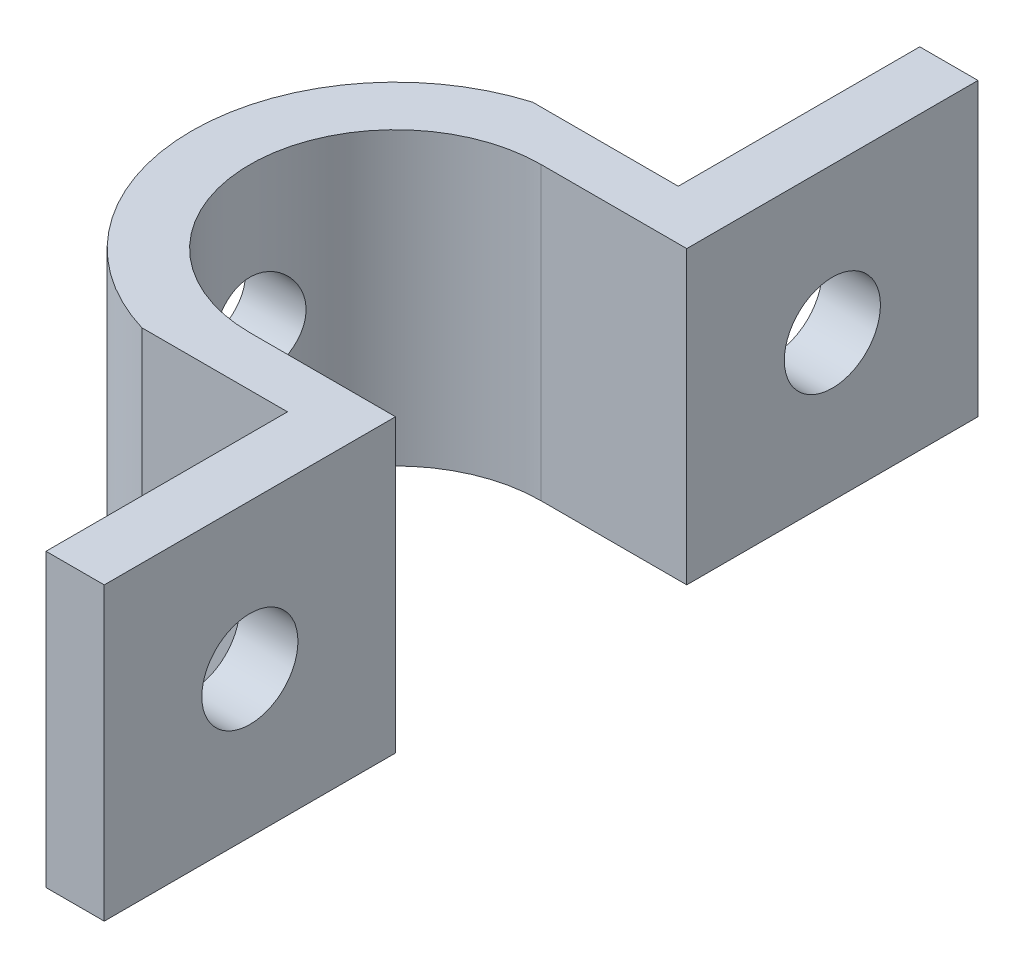
ISO-10303-21;
HEADER;
FILE_DESCRIPTION(('STEP AP214'),'2;1');
FILE_NAME('part.step','',(''),(''),'','','');
FILE_SCHEMA(('AUTOMOTIVE_DESIGN { 1 0 10303 214 1 1 1 1 }'));
ENDSEC;
DATA;
#1=APPLICATION_CONTEXT('core data for automotive mechanical design processes');
#2=APPLICATION_PROTOCOL_DEFINITION('international standard','automotive_design',2000,#1);
#3=PRODUCT_CONTEXT('',#1,'mechanical');
#4=PRODUCT('Part','Part','',(#3));
#5=PRODUCT_RELATED_PRODUCT_CATEGORY('part','',(#4));
#6=PRODUCT_DEFINITION_FORMATION('','',#4);
#7=PRODUCT_DEFINITION_CONTEXT('part definition',#1,'design');
#8=PRODUCT_DEFINITION('design','',#6,#7);
#9=PRODUCT_DEFINITION_SHAPE('','',#8);
#10=(LENGTH_UNIT() NAMED_UNIT(*) SI_UNIT(.MILLI.,.METRE.));
#11=(NAMED_UNIT(*) PLANE_ANGLE_UNIT() SI_UNIT($,.RADIAN.));
#12=(NAMED_UNIT(*) SI_UNIT($,.STERADIAN.) SOLID_ANGLE_UNIT());
#13=UNCERTAINTY_MEASURE_WITH_UNIT(LENGTH_MEASURE(1.E-05),#10,'distance_accuracy_value','');
#14=(GEOMETRIC_REPRESENTATION_CONTEXT(3) GLOBAL_UNCERTAINTY_ASSIGNED_CONTEXT((#13)) GLOBAL_UNIT_ASSIGNED_CONTEXT((#10,
#11,#12)) REPRESENTATION_CONTEXT('',''));
#15=CARTESIAN_POINT('',(0.,0.,0.));
#16=DIRECTION('',(0.,0.,1.));
#17=DIRECTION('',(1.,0.,0.));
#18=AXIS2_PLACEMENT_3D('',#15,#16,#17);
#19=CARTESIAN_POINT('',(-2.,10.,0.));
#20=DIRECTION('',(0.,0.,1.));
#21=DIRECTION('',(1.,0.,0.));
#22=AXIS2_PLACEMENT_3D('',#19,#20,#21);
#23=PLANE('',#22);
#24=DIRECTION('',(0.,-1.,0.));
#25=VECTOR('',#24,1.);
#26=CARTESIAN_POINT('',(3.,10.,0.));
#27=LINE('',#26,#25);
#28=CARTESIAN_POINT('',(3.,10.,0.));
#29=VERTEX_POINT('',#28);
#30=CARTESIAN_POINT('',(3.,0.,0.));
#31=VERTEX_POINT('',#30);
#32=EDGE_CURVE('E71',#29,#31,#27,.T.);
#33=ORIENTED_EDGE('',*,*,#32,.F.);
#34=DIRECTION('',(-1.,0.,0.));
#35=VECTOR('',#34,1.);
#36=CARTESIAN_POINT('',(-2.,10.,0.));
#37=LINE('',#36,#35);
#38=CARTESIAN_POINT('',(5.,10.,0.));
#39=VERTEX_POINT('',#38);
#40=EDGE_CURVE('E206',#39,#29,#37,.T.);
#41=ORIENTED_EDGE('',*,*,#40,.F.);
#42=DIRECTION('',(0.,1.,0.));
#43=VECTOR('',#42,1.);
#44=CARTESIAN_POINT('',(5.,0.,0.));
#45=LINE('',#44,#43);
#46=CARTESIAN_POINT('',(5.,0.,0.));
#47=VERTEX_POINT('',#46);
#48=EDGE_CURVE('E180',#47,#39,#45,.T.);
#49=ORIENTED_EDGE('',*,*,#48,.F.);
#50=DIRECTION('',(-1.,0.,0.));
#51=VECTOR('',#50,1.);
#52=CARTESIAN_POINT('',(-2.,0.,0.));
#53=LINE('',#52,#51);
#54=EDGE_CURVE('E191',#47,#31,#53,.T.);
#55=ORIENTED_EDGE('',*,*,#54,.T.);
#56=EDGE_LOOP('',(#33,#41,#49,#55));
#57=FACE_BOUND('',#56,.T.);
#58=ADVANCED_FACE('F43',(#57),#23,.F.);
#59=CARTESIAN_POINT('',(-2.,10.,30.));
#60=DIRECTION('',(0.,0.,-1.));
#61=DIRECTION('',(-1.,0.,0.));
#62=AXIS2_PLACEMENT_3D('',#59,#60,#61);
#63=PLANE('',#62);
#64=DIRECTION('',(0.,1.,0.));
#65=VECTOR('',#64,1.);
#66=CARTESIAN_POINT('',(3.,0.,30.));
#67=LINE('',#66,#65);
#68=CARTESIAN_POINT('',(3.,0.,30.));
#69=VERTEX_POINT('',#68);
#70=CARTESIAN_POINT('',(3.,10.,30.));
#71=VERTEX_POINT('',#70);
#72=EDGE_CURVE('E168',#69,#71,#67,.T.);
#73=ORIENTED_EDGE('',*,*,#72,.F.);
#74=DIRECTION('',(1.,0.,0.));
#75=VECTOR('',#74,1.);
#76=CARTESIAN_POINT('',(-2.,0.,30.));
#77=LINE('',#76,#75);
#78=CARTESIAN_POINT('',(5.,0.,30.));
#79=VERTEX_POINT('',#78);
#80=EDGE_CURVE('E220',#69,#79,#77,.T.);
#81=ORIENTED_EDGE('',*,*,#80,.T.);
#82=DIRECTION('',(0.,-1.,0.));
#83=VECTOR('',#82,1.);
#84=CARTESIAN_POINT('',(5.,10.,30.));
#85=LINE('',#84,#83);
#86=CARTESIAN_POINT('',(5.,10.,30.));
#87=VERTEX_POINT('',#86);
#88=EDGE_CURVE('E177',#87,#79,#85,.T.);
#89=ORIENTED_EDGE('',*,*,#88,.F.);
#90=DIRECTION('',(1.,0.,0.));
#91=VECTOR('',#90,1.);
#92=CARTESIAN_POINT('',(-2.,10.,30.));
#93=LINE('',#92,#91);
#94=EDGE_CURVE('E213',#71,#87,#93,.T.);
#95=ORIENTED_EDGE('',*,*,#94,.F.);
#96=EDGE_LOOP('',(#73,#81,#89,#95));
#97=FACE_BOUND('',#96,.T.);
#98=ADVANCED_FACE('F310',(#97),#63,.F.);
#99=CARTESIAN_POINT('',(0.,10.,15.));
#100=DIRECTION('',(0.,-1.,0.));
#101=DIRECTION('',(0.,0.,-1.));
#102=AXIS2_PLACEMENT_3D('',#99,#100,#101);
#103=CYLINDRICAL_SURFACE('',#102,7.);
#104=CARTESIAN_POINT('',(-6.80275679412398,5.,16.65));
#105=CARTESIAN_POINT('',(-6.80275861136205,4.90871099997652,16.6499971300732));
#106=CARTESIAN_POINT('',(-6.80461440498174,4.81738900161891,16.6423981344));
#107=CARTESIAN_POINT('',(-6.81182064992733,4.63735543656597,16.612244147676));
#108=CARTESIAN_POINT('',(-6.81717336620826,4.54864560071145,16.5896794632121));
#109=CARTESIAN_POINT('',(-6.83073431325551,4.37646648747663,16.5303551503609));
#110=CARTESIAN_POINT('',(-6.83893911932177,4.29299106604051,16.4936125405845));
#111=CARTESIAN_POINT('',(-6.85727558075245,4.13338346720995,16.4070258185496));
#112=CARTESIAN_POINT('',(-6.86740726130097,4.05725138581207,16.3571815350499));
#113=CARTESIAN_POINT('',(-6.88867782513987,3.91300017131405,16.2447646190835));
#114=CARTESIAN_POINT('',(-6.89983131541127,3.84504595472281,16.1819830935587));
#115=CARTESIAN_POINT('',(-6.92176152937785,3.72052828829883,16.0459242729893));
#116=CARTESIAN_POINT('',(-6.93253822068664,3.66396581562248,15.9726460784875));
#117=CARTESIAN_POINT('',(-6.95266103704034,3.56317303018273,15.816555491677));
#118=CARTESIAN_POINT('',(-6.96198791366554,3.51910313876716,15.7336368144797));
#119=CARTESIAN_POINT('',(-6.97799434603916,3.44558709172224,15.5613128385626));
#120=CARTESIAN_POINT('',(-6.98467424785277,3.41613902430984,15.4719083896014));
#121=CARTESIAN_POINT('',(-6.99453084372035,3.37322629782888,15.2908680220524));
#122=CARTESIAN_POINT('',(-6.99776875317269,3.35948200603305,15.1993017757155));
#123=CARTESIAN_POINT('',(-7.00058928212562,3.34749086323874,15.0151097839079));
#124=CARTESIAN_POINT('',(-7.00017238432294,3.34924196573697,14.9224841799622));
#125=CARTESIAN_POINT('',(-6.99577641572094,3.36798740501016,14.74073663216));
#126=CARTESIAN_POINT('',(-6.99186783471482,3.38468011500454,14.6515816196809));
#127=CARTESIAN_POINT('',(-6.98100889430398,3.43235207443573,14.4773753750162));
#128=CARTESIAN_POINT('',(-6.97405838372646,3.46333203390087,14.3923243470169));
#129=CARTESIAN_POINT('',(-6.95778608866946,3.53895377039328,14.2279256132054));
#130=CARTESIAN_POINT('',(-6.94844521053821,3.58370617046967,14.148630760275));
#131=CARTESIAN_POINT('',(-6.92841069918988,3.685519225885,13.998568639297));
#132=CARTESIAN_POINT('',(-6.91771685448099,3.74258180650105,13.92780270785));
#133=CARTESIAN_POINT('',(-6.89584251761335,3.86902452509401,13.7950103439417));
#134=CARTESIAN_POINT('',(-6.88465650871199,3.93866849569449,13.7332357899427));
#135=CARTESIAN_POINT('',(-6.86329717958811,4.0874443211498,13.6221906360801));
#136=CARTESIAN_POINT('',(-6.85312389657327,4.16657652436841,13.5729204955273));
#137=CARTESIAN_POINT('',(-6.83492437266263,4.33253525980705,13.4881452284223));
#138=CARTESIAN_POINT('',(-6.82690665922475,4.41939059395085,13.4526945301079));
#139=CARTESIAN_POINT('',(-6.8140390867396,4.59806127756916,13.3969722848722));
#140=CARTESIAN_POINT('',(-6.80918863409247,4.68987569413077,13.3766978935421));
#141=CARTESIAN_POINT('',(-6.80332774943589,4.87353855694924,13.3523087210196));
#142=CARTESIAN_POINT('',(-6.80222947433876,4.96533515973006,13.3478242013954));
#143=CARTESIAN_POINT('',(-6.80375919481422,5.14836457658374,13.3541351120498));
#144=CARTESIAN_POINT('',(-6.80638688917233,5.23959743563189,13.3649293071677));
#145=CARTESIAN_POINT('',(-6.81498886694796,5.41757745074747,13.4011685953919));
#146=CARTESIAN_POINT('',(-6.82091521063605,5.50436984565375,13.4264039574829));
#147=CARTESIAN_POINT('',(-6.83540229380027,5.67249368663451,13.4905793012613));
#148=CARTESIAN_POINT('',(-6.84396331787599,5.75382454159378,13.5295207635542));
#149=CARTESIAN_POINT('',(-6.86294389007106,5.91029905658938,13.6207958904044));
#150=CARTESIAN_POINT('',(-6.87339357272798,5.98530818474253,13.6733537849148));
#151=CARTESIAN_POINT('',(-6.89489755256543,6.12557800629822,13.7900817098675));
#152=CARTESIAN_POINT('',(-6.90595193742742,6.19083728083161,13.854253427438));
#153=CARTESIAN_POINT('',(-6.92771364919943,6.31122298204255,13.9940731838202));
#154=CARTESIAN_POINT('',(-6.93840801965822,6.36609535547159,14.0699423397795));
#155=CARTESIAN_POINT('',(-6.95799159344945,6.46231801677791,14.2300347792411));
#156=CARTESIAN_POINT('',(-6.96688088727282,6.50366898256505,14.3142576436454));
#157=CARTESIAN_POINT('',(-6.98179887024889,6.57133783893331,14.4881057278654));
#158=CARTESIAN_POINT('',(-6.98784709878863,6.59775867456761,14.577689122752));
#159=CARTESIAN_POINT('',(-6.99648655479454,6.63513286894146,14.7601837980261));
#160=CARTESIAN_POINT('',(-6.99907837091255,6.64608886147333,14.8530945089796));
#161=CARTESIAN_POINT('',(-7.00049202890772,6.65208813057133,15.0372082467747));
#162=CARTESIAN_POINT('',(-6.9994031706394,6.64750832426096,15.1283985042107));
#163=CARTESIAN_POINT('',(-6.99377268350157,6.62341975270527,15.3086707298165));
#164=CARTESIAN_POINT('',(-6.98923113721447,6.60391134452658,15.3977527483593));
#165=CARTESIAN_POINT('',(-6.97721604451342,6.55071176108928,15.5709335768956));
#166=CARTESIAN_POINT('',(-6.96975517685192,6.51708187051132,15.6550521493591));
#167=CARTESIAN_POINT('',(-6.95269208722048,6.4366509910792,15.8164987953648));
#168=CARTESIAN_POINT('',(-6.94308962308135,6.38984851252764,15.893826099579));
#169=CARTESIAN_POINT('',(-6.92252474173611,6.28321390355334,16.0413072599721));
#170=CARTESIAN_POINT('',(-6.91153737485731,6.22312153020512,16.1112694814733));
#171=CARTESIAN_POINT('',(-6.88956325338245,6.09212760248887,16.2402452333942));
#172=CARTESIAN_POINT('',(-6.87857649960749,6.02122338274089,16.299256056056));
#173=CARTESIAN_POINT('',(-6.85764827463158,5.86924540614473,16.4055784964365));
#174=CARTESIAN_POINT('',(-6.84772646444862,5.7880263885213,16.4526866153972));
#175=CARTESIAN_POINT('',(-6.83030721412674,5.61860266624687,16.532509311262));
#176=CARTESIAN_POINT('',(-6.82280787287529,5.53040350750556,16.5652351824176));
#177=CARTESIAN_POINT('',(-6.81235745600281,5.36853084559052,16.6100284268064));
#178=CARTESIAN_POINT('',(-6.80878274857867,5.29568399515568,16.6249870041652));
#179=CARTESIAN_POINT('',(-6.8039817559383,5.14856531846772,16.644973629764));
#180=CARTESIAN_POINT('',(-6.80275531520391,5.07429358690895,16.6500023356282));
#181=CARTESIAN_POINT('',(-6.80275679412398,5.,16.65));
#182=B_SPLINE_CURVE_WITH_KNOTS('',3,(#104,#105,#106,#107,#108,#109,#110,#111,#112,#113,#114,
#115,#116,#117,#118,#119,#120,#121,#122,#123,#124,#125,#126,#127,#128,#129,#130,#131,#132,#133,
#134,#135,#136,#137,#138,#139,#140,#141,#142,#143,#144,#145,#146,#147,#148,#149,#150,#151,#152,
#153,#154,#155,#156,#157,#158,#159,#160,#161,#162,#163,#164,#165,#166,#167,#168,#169,#170,#171,
#172,#173,#174,#175,#176,#177,#178,#179,#180,#181),.UNSPECIFIED.,.T.,.F.,(4,2,2,2,2,2,2,2,2,2,2,
2,2,2,2,2,2,2,2,2,2,2,2,2,2,2,2,2,2,2,2,2,2,2,2,2,2,2,4),(0.,0.273594440399258,
0.547366263700774,0.820810479503747,1.0942582694491,1.37252656286893,1.65081871531698,
1.93253747960749,2.21421939985748,2.49080324523182,2.76735056224876,3.03843805884697,
3.30953902903524,3.5828770280852,3.85625780745004,4.13623055025586,4.41621357550839,
4.69728844125184,4.97831061353603,5.25270687968444,5.52708096437946,5.79756789407088,
6.06808405216623,6.34337456664897,6.61870510445458,6.90008328124663,7.18144734868653,
7.46084693391316,7.74019892930651,8.01282246332762,8.28543947686365,8.55688541369867,
8.82836206089265,9.10571835709369,9.38314313916058,9.66503130549495,9.9466977102697,
10.1693714016501,10.3920303455577),.UNSPECIFIED.);
#183=CARTESIAN_POINT('',(-6.80275679412398,5.,16.65));
#184=VERTEX_POINT('',#183);
#185=EDGE_CURVE('E253',#184,#184,#182,.T.);
#186=ORIENTED_EDGE('',*,*,#185,.T.);
#187=EDGE_LOOP('',(#186));
#188=FACE_BOUND('',#187,.T.);
#189=CARTESIAN_POINT('',(0.,0.,15.));
#190=DIRECTION('',(0.,1.,0.));
#191=DIRECTION('',(0.,0.,1.));
#192=AXIS2_PLACEMENT_3D('',#189,#190,#191);
#193=CIRCLE('',#192,7.);
#194=CARTESIAN_POINT('',(-2.,0.,8.29179606750063));
#195=VERTEX_POINT('',#194);
#196=CARTESIAN_POINT('',(-2.,0.,21.7082039324994));
#197=VERTEX_POINT('',#196);
#198=EDGE_CURVE('E155',#195,#197,#193,.T.);
#199=ORIENTED_EDGE('',*,*,#198,.T.);
#200=DIRECTION('',(0.,-1.,0.));
#201=VECTOR('',#200,1.);
#202=CARTESIAN_POINT('',(-2.,10.,21.7082039324994));
#203=LINE('',#202,#201);
#204=CARTESIAN_POINT('',(-2.,10.,21.7082039324994));
#205=VERTEX_POINT('',#204);
#206=EDGE_CURVE('E56',#205,#197,#203,.T.);
#207=ORIENTED_EDGE('',*,*,#206,.F.);
#208=CARTESIAN_POINT('',(0.,10.,15.));
#209=DIRECTION('',(0.,1.,0.));
#210=DIRECTION('',(0.,0.,1.));
#211=AXIS2_PLACEMENT_3D('',#208,#209,#210);
#212=CIRCLE('',#211,7.);
#213=CARTESIAN_POINT('',(-2.,10.,8.29179606750063));
#214=VERTEX_POINT('',#213);
#215=EDGE_CURVE('E209',#214,#205,#212,.T.);
#216=ORIENTED_EDGE('',*,*,#215,.F.);
#217=DIRECTION('',(0.,-1.,0.));
#218=VECTOR('',#217,1.);
#219=CARTESIAN_POINT('',(-2.,10.,8.29179606750063));
#220=LINE('',#219,#218);
#221=EDGE_CURVE('E11',#214,#195,#220,.T.);
#222=ORIENTED_EDGE('',*,*,#221,.T.);
#223=EDGE_LOOP('',(#199,#207,#216,#222));
#224=FACE_BOUND('',#223,.T.);
#225=ADVANCED_FACE('F236',(#188,#224),#103,.T.);
#226=CARTESIAN_POINT('',(0.,10.,15.));
#227=DIRECTION('',(0.,-1.,0.));
#228=DIRECTION('',(0.,0.,-1.));
#229=AXIS2_PLACEMENT_3D('',#226,#227,#228);
#230=CYLINDRICAL_SURFACE('',#229,5.);
#231=CARTESIAN_POINT('',(-4.71990466005406,5.,16.65));
#232=CARTESIAN_POINT('',(-4.71990452115883,5.08992939929063,16.650000243605));
#233=CARTESIAN_POINT('',(-4.72250292266519,5.17985768649969,16.6426230381865));
#234=CARTESIAN_POINT('',(-4.73256311651638,5.35705367343518,16.6134061681748));
#235=CARTESIAN_POINT('',(-4.74002579119603,5.4443208874604,16.5915638797359));
#236=CARTESIAN_POINT('',(-4.75887919770347,5.61359969937908,16.5342646581981));
#237=CARTESIAN_POINT('',(-4.77026235105614,5.69562107766353,16.4988339772241));
#238=CARTESIAN_POINT('',(-4.79566317693293,5.85258149635711,16.4154530353585));
#239=CARTESIAN_POINT('',(-4.80968141232602,5.92751901846369,16.3675000987865));
#240=CARTESIAN_POINT('',(-4.83937566103107,6.07105763938825,16.2584665430876));
#241=CARTESIAN_POINT('',(-4.85509238793419,6.13934748573353,16.1969871597991));
#242=CARTESIAN_POINT('',(-4.88606822622471,6.26485926767889,16.0634972766317));
#243=CARTESIAN_POINT('',(-4.90132726544299,6.322079465466,15.9914851263355));
#244=CARTESIAN_POINT('',(-4.93013890958224,6.42523358902282,15.8367042156024));
#245=CARTESIAN_POINT('',(-4.94363804307574,6.47084230640669,15.7537078872784));
#246=CARTESIAN_POINT('',(-4.9669298740668,6.54732873484977,15.5806996850409));
#247=CARTESIAN_POINT('',(-4.97672354920831,6.57821033205655,15.4906896691795));
#248=CARTESIAN_POINT('',(-4.99121262924258,6.62331307187515,15.3094718310711));
#249=CARTESIAN_POINT('',(-4.99607073696453,6.63806721498854,15.2184099163068));
#250=CARTESIAN_POINT('',(-5.00071837425094,6.65218999871481,15.0349820134684));
#251=CARTESIAN_POINT('',(-5.00050918484354,6.65156252784608,14.9426163608841));
#252=CARTESIAN_POINT('',(-4.99515654976729,6.63528002545685,14.7629720669061));
#253=CARTESIAN_POINT('',(-4.99020313675408,6.6202037350628,14.6756343840473));
#254=CARTESIAN_POINT('',(-4.9761564157389,6.57640739681431,14.504806422331));
#255=CARTESIAN_POINT('',(-4.96706282865059,6.54768642917574,14.4213164032597));
#256=CARTESIAN_POINT('',(-4.94551338736031,6.47707262193577,14.2592768953069));
#257=CARTESIAN_POINT('',(-4.93301533884174,6.43501331574259,14.1808057924134));
#258=CARTESIAN_POINT('',(-4.90596050876768,6.33905332496135,14.0318625999836));
#259=CARTESIAN_POINT('',(-4.89140316323876,6.28514939427669,13.9613927112778));
#260=CARTESIAN_POINT('',(-4.86097294536879,6.16410482353283,13.8270082474127));
#261=CARTESIAN_POINT('',(-4.84507036749807,6.09646769426565,13.7635469540563));
#262=CARTESIAN_POINT('',(-4.81431124792123,5.95137341036443,13.6487229961694));
#263=CARTESIAN_POINT('',(-4.79945486104327,5.87391480695885,13.5973621197797));
#264=CARTESIAN_POINT('',(-4.77230967313123,5.70996560114244,13.5075861767389));
#265=CARTESIAN_POINT('',(-4.76005891661915,5.62336561233863,13.4693584945687));
#266=CARTESIAN_POINT('',(-4.73995346804782,5.44445239284249,13.4081801822624));
#267=CARTESIAN_POINT('',(-4.73209697762928,5.35214151654173,13.3852233018009));
#268=CARTESIAN_POINT('',(-4.72207527963097,5.16880983230075,13.3561531740768));
#269=CARTESIAN_POINT('',(-4.71967327795615,5.0779131556508,13.3493385439829));
#270=CARTESIAN_POINT('',(-4.7201713665852,4.89626215211207,13.3507625050791));
#271=CARTESIAN_POINT('',(-4.72307051828915,4.80550780287081,13.3589984314808));
#272=CARTESIAN_POINT('',(-4.73360855675225,4.62987992776333,13.3896600287622));
#273=CARTESIAN_POINT('',(-4.74108573426459,4.54491123060324,13.4116020728041));
#274=CARTESIAN_POINT('',(-4.75976051805482,4.37987739298326,13.468474771533));
#275=CARTESIAN_POINT('',(-4.77095877549975,4.2998131136739,13.5034076996758));
#276=CARTESIAN_POINT('',(-4.79624726899171,4.14408997295919,13.5865115743525));
#277=CARTESIAN_POINT('',(-4.81041691149477,4.06864683097438,13.6350619330135));
#278=CARTESIAN_POINT('',(-4.83989585604412,3.92672439625333,13.7435904200953));
#279=CARTESIAN_POINT('',(-4.85520548680903,3.86024770467313,13.8035718525317));
#280=CARTESIAN_POINT('',(-4.88610989384612,3.73491681921652,13.9366087615796));
#281=CARTESIAN_POINT('',(-4.90168425037641,3.67656776107347,14.0101462360769));
#282=CARTESIAN_POINT('',(-4.93065204495412,3.57300735840891,14.1663508226466));
#283=CARTESIAN_POINT('',(-4.94404556482344,3.52779552094755,14.2490175920054));
#284=CARTESIAN_POINT('',(-4.96707750850083,3.45221100774121,14.4207042846202));
#285=CARTESIAN_POINT('',(-4.976740841375,3.42173954125647,14.5096771970414));
#286=CARTESIAN_POINT('',(-4.99133146825929,3.37631330680774,14.6918652641417));
#287=CARTESIAN_POINT('',(-4.99626043401974,3.36135306153476,14.7850789091914));
#288=CARTESIAN_POINT('',(-5.00070328980923,3.34785918214313,14.9684774135301));
#289=CARTESIAN_POINT('',(-5.00045646732494,3.34859968791082,15.0586036580669));
#290=CARTESIAN_POINT('',(-4.99516201889143,3.36470152427364,15.2373880282905));
#291=CARTESIAN_POINT('',(-4.99011476942583,3.38006170828971,15.326046268554));
#292=CARTESIAN_POINT('',(-4.97587240449466,3.42448830592424,15.4980296657855));
#293=CARTESIAN_POINT('',(-4.96674195827476,3.45334133491917,15.5814156803772));
#294=CARTESIAN_POINT('',(-4.94527347683187,3.52373789478141,15.7421968074289));
#295=CARTESIAN_POINT('',(-4.93293486552038,3.56528370511945,15.8195908406695));
#296=CARTESIAN_POINT('',(-4.90576374946711,3.66163265392507,15.969268380933));
#297=CARTESIAN_POINT('',(-4.8908566849274,3.71686414809695,16.0412624426929));
#298=CARTESIAN_POINT('',(-4.86041514438607,3.8382836506441,16.1751981855517));
#299=CARTESIAN_POINT('',(-4.84488047141097,3.90447511929778,16.2371366796408));
#300=CARTESIAN_POINT('',(-4.81423121094683,4.04895585145464,16.3516017981425));
#301=CARTESIAN_POINT('',(-4.79915525016869,4.12761026948916,16.4036792928643));
#302=CARTESIAN_POINT('',(-4.7718636868793,4.29302166212418,16.4938362822388));
#303=CARTESIAN_POINT('',(-4.759647267495,4.37977631283495,16.5319197762739));
#304=CARTESIAN_POINT('',(-4.74014636717988,4.55434327244323,16.5912073476447));
#305=CARTESIAN_POINT('',(-4.7326392026776,4.64186804193521,16.6131835519048));
#306=CARTESIAN_POINT('',(-4.7225192193515,4.81959617129269,16.6425773745118));
#307=CARTESIAN_POINT('',(-4.71990479936932,4.90979864505526,16.6499997556583));
#308=CARTESIAN_POINT('',(-4.71990466005406,5.,16.65));
#309=B_SPLINE_CURVE_WITH_KNOTS('',3,(#231,#232,#233,#234,#235,#236,#237,#238,#239,#240,#241,
#242,#243,#244,#245,#246,#247,#248,#249,#250,#251,#252,#253,#254,#255,#256,#257,#258,#259,#260,
#261,#262,#263,#264,#265,#266,#267,#268,#269,#270,#271,#272,#273,#274,#275,#276,#277,#278,#279,
#280,#281,#282,#283,#284,#285,#286,#287,#288,#289,#290,#291,#292,#293,#294,#295,#296,#297,#298,
#299,#300,#301,#302,#303,#304,#305,#306,#307,#308),.UNSPECIFIED.,.T.,.F.,(4,2,2,2,2,2,2,2,2,2,2,
2,2,2,2,2,2,2,2,2,2,2,2,2,2,2,2,2,2,2,2,2,2,2,2,2,2,2,4),(0.,0.269454302916435,
0.538957495994025,0.807942623457632,1.07698527314817,1.3553904348317,1.63383926765626,
1.91939248597707,2.2048703116341,2.48059787689522,2.75625573811558,3.02131448573183,
3.28639110342469,3.55491555402299,3.82351368748603,4.10452131305698,4.38557043856028,
4.67047751353534,4.95526790443248,5.22743703243199,5.49955797597573,5.76258081799807,
6.02564971172707,6.29693565916083,6.56830013781585,6.85241935986189,7.13652791970021,
7.41870503995781,7.70078248410447,7.96984890311455,8.23889422176275,8.50382155957889,
8.76879650315115,9.04343817678385,9.31816672608183,9.60337461850677,9.88850093710113,
10.1588585876967,10.4291277478431),.UNSPECIFIED.);
#310=CARTESIAN_POINT('',(-4.71990466005406,5.,16.65));
#311=VERTEX_POINT('',#310);
#312=EDGE_CURVE('E46',#311,#311,#309,.T.);
#313=ORIENTED_EDGE('',*,*,#312,.T.);
#314=EDGE_LOOP('',(#313));
#315=FACE_BOUND('',#314,.T.);
#316=CARTESIAN_POINT('',(0.,0.,15.));
#317=DIRECTION('',(0.,-1.,0.));
#318=DIRECTION('',(0.,0.,1.));
#319=AXIS2_PLACEMENT_3D('',#316,#317,#318);
#320=CIRCLE('',#319,5.);
#321=CARTESIAN_POINT('',(0.,0.,20.));
#322=VERTEX_POINT('',#321);
#323=CARTESIAN_POINT('',(0.,0.,10.));
#324=VERTEX_POINT('',#323);
#325=EDGE_CURVE('E210',#322,#324,#320,.T.);
#326=ORIENTED_EDGE('',*,*,#325,.T.);
#327=DIRECTION('',(0.,-1.,0.));
#328=VECTOR('',#327,1.);
#329=CARTESIAN_POINT('',(0.,10.,10.));
#330=LINE('',#329,#328);
#331=CARTESIAN_POINT('',(0.,10.,10.));
#332=VERTEX_POINT('',#331);
#333=EDGE_CURVE('E217',#332,#324,#330,.T.);
#334=ORIENTED_EDGE('',*,*,#333,.F.);
#335=CARTESIAN_POINT('',(0.,10.,15.));
#336=DIRECTION('',(0.,-1.,0.));
#337=DIRECTION('',(0.,0.,1.));
#338=AXIS2_PLACEMENT_3D('',#335,#336,#337);
#339=CIRCLE('',#338,5.);
#340=CARTESIAN_POINT('',(0.,10.,20.));
#341=VERTEX_POINT('',#340);
#342=EDGE_CURVE('E215',#341,#332,#339,.T.);
#343=ORIENTED_EDGE('',*,*,#342,.F.);
#344=DIRECTION('',(0.,-1.,0.));
#345=VECTOR('',#344,1.);
#346=CARTESIAN_POINT('',(0.,10.,20.));
#347=LINE('',#346,#345);
#348=EDGE_CURVE('E225',#341,#322,#347,.T.);
#349=ORIENTED_EDGE('',*,*,#348,.T.);
#350=EDGE_LOOP('',(#326,#334,#343,#349));
#351=FACE_BOUND('',#350,.T.);
#352=ADVANCED_FACE('F305',(#315,#351),#230,.F.);
#353=CARTESIAN_POINT('',(0.,10.,15.));
#354=DIRECTION('',(0.,1.,0.));
#355=DIRECTION('',(0.,0.,1.));
#356=AXIS2_PLACEMENT_3D('',#353,#354,#355);
#357=PLANE('',#356);
#358=DIRECTION('',(-1.,0.,0.));
#359=VECTOR('',#358,1.);
#360=CARTESIAN_POINT('',(3.,10.,8.29179606750063));
#361=LINE('',#360,#359);
#362=CARTESIAN_POINT('',(3.,10.,8.29179606750063));
#363=VERTEX_POINT('',#362);
#364=EDGE_CURVE('E142',#363,#214,#361,.T.);
#365=ORIENTED_EDGE('',*,*,#364,.T.);
#366=ORIENTED_EDGE('',*,*,#215,.T.);
#367=DIRECTION('',(-1.,0.,0.));
#368=VECTOR('',#367,1.);
#369=CARTESIAN_POINT('',(3.,10.,21.7082039324994));
#370=LINE('',#369,#368);
#371=CARTESIAN_POINT('',(3.,10.,21.7082039324994));
#372=VERTEX_POINT('',#371);
#373=EDGE_CURVE('E164',#372,#205,#370,.T.);
#374=ORIENTED_EDGE('',*,*,#373,.F.);
#375=DIRECTION('',(0.,0.,-1.));
#376=VECTOR('',#375,1.);
#377=CARTESIAN_POINT('',(3.,10.,30.));
#378=LINE('',#377,#376);
#379=EDGE_CURVE('E163',#71,#372,#378,.T.);
#380=ORIENTED_EDGE('',*,*,#379,.F.);
#381=ORIENTED_EDGE('',*,*,#94,.T.);
#382=DIRECTION('',(0.,0.,1.));
#383=VECTOR('',#382,1.);
#384=CARTESIAN_POINT('',(5.,10.,20.));
#385=LINE('',#384,#383);
#386=CARTESIAN_POINT('',(5.,10.,20.));
#387=VERTEX_POINT('',#386);
#388=EDGE_CURVE('E197',#387,#87,#385,.T.);
#389=ORIENTED_EDGE('',*,*,#388,.F.);
#390=DIRECTION('',(-1.,0.,0.));
#391=VECTOR('',#390,1.);
#392=CARTESIAN_POINT('',(5.,10.,20.));
#393=LINE('',#392,#391);
#394=EDGE_CURVE('E194',#387,#341,#393,.T.);
#395=ORIENTED_EDGE('',*,*,#394,.T.);
#396=ORIENTED_EDGE('',*,*,#342,.T.);
#397=DIRECTION('',(-1.,0.,0.));
#398=VECTOR('',#397,1.);
#399=CARTESIAN_POINT('',(5.,10.,10.));
#400=LINE('',#399,#398);
#401=CARTESIAN_POINT('',(5.,10.,10.));
#402=VERTEX_POINT('',#401);
#403=EDGE_CURVE('E185',#402,#332,#400,.T.);
#404=ORIENTED_EDGE('',*,*,#403,.F.);
#405=DIRECTION('',(0.,0.,1.));
#406=VECTOR('',#405,1.);
#407=CARTESIAN_POINT('',(5.,10.,0.));
#408=LINE('',#407,#406);
#409=EDGE_CURVE('E183',#39,#402,#408,.T.);
#410=ORIENTED_EDGE('',*,*,#409,.F.);
#411=ORIENTED_EDGE('',*,*,#40,.T.);
#412=DIRECTION('',(0.,0.,-1.));
#413=VECTOR('',#412,1.);
#414=CARTESIAN_POINT('',(3.,10.,8.29179606750063));
#415=LINE('',#414,#413);
#416=EDGE_CURVE('E144',#363,#29,#415,.T.);
#417=ORIENTED_EDGE('',*,*,#416,.F.);
#418=EDGE_LOOP('',(#365,#366,#374,#380,#381,#389,#395,#396,#404,#410,#411,#417));
#419=FACE_BOUND('',#418,.T.);
#420=ADVANCED_FACE('F238',(#419),#357,.T.);
#421=CARTESIAN_POINT('',(0.,0.,15.));
#422=DIRECTION('',(0.,1.,0.));
#423=DIRECTION('',(0.,0.,1.));
#424=AXIS2_PLACEMENT_3D('',#421,#422,#423);
#425=PLANE('',#424);
#426=ORIENTED_EDGE('',*,*,#198,.F.);
#427=DIRECTION('',(-1.,0.,0.));
#428=VECTOR('',#427,1.);
#429=CARTESIAN_POINT('',(3.,0.,8.29179606750063));
#430=LINE('',#429,#428);
#431=CARTESIAN_POINT('',(3.,0.,8.29179606750063));
#432=VERTEX_POINT('',#431);
#433=EDGE_CURVE('E140',#432,#195,#430,.T.);
#434=ORIENTED_EDGE('',*,*,#433,.F.);
#435=DIRECTION('',(0.,0.,1.));
#436=VECTOR('',#435,1.);
#437=CARTESIAN_POINT('',(3.,0.,0.));
#438=LINE('',#437,#436);
#439=EDGE_CURVE('E145',#31,#432,#438,.T.);
#440=ORIENTED_EDGE('',*,*,#439,.F.);
#441=ORIENTED_EDGE('',*,*,#54,.F.);
#442=DIRECTION('',(0.,0.,-1.));
#443=VECTOR('',#442,1.);
#444=CARTESIAN_POINT('',(5.,0.,10.));
#445=LINE('',#444,#443);
#446=CARTESIAN_POINT('',(5.,0.,10.));
#447=VERTEX_POINT('',#446);
#448=EDGE_CURVE('E176',#447,#47,#445,.T.);
#449=ORIENTED_EDGE('',*,*,#448,.F.);
#450=DIRECTION('',(-1.,0.,0.));
#451=VECTOR('',#450,1.);
#452=CARTESIAN_POINT('',(5.,0.,10.));
#453=LINE('',#452,#451);
#454=EDGE_CURVE('E188',#447,#324,#453,.T.);
#455=ORIENTED_EDGE('',*,*,#454,.T.);
#456=ORIENTED_EDGE('',*,*,#325,.F.);
#457=DIRECTION('',(-1.,0.,0.));
#458=VECTOR('',#457,1.);
#459=CARTESIAN_POINT('',(5.,0.,20.));
#460=LINE('',#459,#458);
#461=CARTESIAN_POINT('',(5.,0.,20.));
#462=VERTEX_POINT('',#461);
#463=EDGE_CURVE('E157',#462,#322,#460,.T.);
#464=ORIENTED_EDGE('',*,*,#463,.F.);
#465=DIRECTION('',(0.,0.,-1.));
#466=VECTOR('',#465,1.);
#467=CARTESIAN_POINT('',(5.,0.,30.));
#468=LINE('',#467,#466);
#469=EDGE_CURVE('E202',#79,#462,#468,.T.);
#470=ORIENTED_EDGE('',*,*,#469,.F.);
#471=ORIENTED_EDGE('',*,*,#80,.F.);
#472=DIRECTION('',(0.,0.,1.));
#473=VECTOR('',#472,1.);
#474=CARTESIAN_POINT('',(3.,0.,21.7082039324994));
#475=LINE('',#474,#473);
#476=CARTESIAN_POINT('',(3.,0.,21.7082039324994));
#477=VERTEX_POINT('',#476);
#478=EDGE_CURVE('E170',#477,#69,#475,.T.);
#479=ORIENTED_EDGE('',*,*,#478,.F.);
#480=DIRECTION('',(-1.,0.,0.));
#481=VECTOR('',#480,1.);
#482=CARTESIAN_POINT('',(3.,0.,21.7082039324994));
#483=LINE('',#482,#481);
#484=EDGE_CURVE('E161',#477,#197,#483,.T.);
#485=ORIENTED_EDGE('',*,*,#484,.T.);
#486=EDGE_LOOP('',(#426,#434,#440,#441,#449,#455,#456,#464,#470,#471,#479,#485));
#487=FACE_BOUND('',#486,.T.);
#488=ADVANCED_FACE('F152',(#487),#425,.F.);
#489=CARTESIAN_POINT('',(5.,0.,20.));
#490=DIRECTION('',(0.,0.,1.));
#491=DIRECTION('',(1.,0.,0.));
#492=AXIS2_PLACEMENT_3D('',#489,#490,#491);
#493=PLANE('',#492);
#494=ORIENTED_EDGE('',*,*,#348,.F.);
#495=ORIENTED_EDGE('',*,*,#394,.F.);
#496=DIRECTION('',(0.,1.,0.));
#497=VECTOR('',#496,1.);
#498=CARTESIAN_POINT('',(5.,0.,20.));
#499=LINE('',#498,#497);
#500=EDGE_CURVE('E200',#462,#387,#499,.T.);
#501=ORIENTED_EDGE('',*,*,#500,.F.);
#502=ORIENTED_EDGE('',*,*,#463,.T.);
#503=EDGE_LOOP('',(#494,#495,#501,#502));
#504=FACE_BOUND('',#503,.T.);
#505=ADVANCED_FACE('F296',(#504),#493,.F.);
#506=CARTESIAN_POINT('',(5.,0.,0.));
#507=DIRECTION('',(1.,0.,0.));
#508=DIRECTION('',(0.,0.,-1.));
#509=AXIS2_PLACEMENT_3D('',#506,#507,#508);
#510=PLANE('',#509);
#511=CARTESIAN_POINT('',(5.,5.,25.));
#512=DIRECTION('',(1.,0.,0.));
#513=DIRECTION('',(0.,0.,-1.));
#514=AXIS2_PLACEMENT_3D('',#511,#512,#513);
#515=CIRCLE('',#514,1.65);
#516=CARTESIAN_POINT('',(5.,5.,23.35));
#517=VERTEX_POINT('',#516);
#518=EDGE_CURVE('E166',#517,#517,#515,.T.);
#519=ORIENTED_EDGE('',*,*,#518,.F.);
#520=EDGE_LOOP('',(#519));
#521=FACE_BOUND('',#520,.T.);
#522=ORIENTED_EDGE('',*,*,#88,.T.);
#523=ORIENTED_EDGE('',*,*,#469,.T.);
#524=ORIENTED_EDGE('',*,*,#500,.T.);
#525=ORIENTED_EDGE('',*,*,#388,.T.);
#526=EDGE_LOOP('',(#522,#523,#524,#525));
#527=FACE_BOUND('',#526,.T.);
#528=ADVANCED_FACE('F294',(#521,#527),#510,.T.);
#529=CARTESIAN_POINT('',(5.,10.,10.));
#530=DIRECTION('',(0.,0.,-1.));
#531=DIRECTION('',(-1.,0.,0.));
#532=AXIS2_PLACEMENT_3D('',#529,#530,#531);
#533=PLANE('',#532);
#534=ORIENTED_EDGE('',*,*,#333,.T.);
#535=ORIENTED_EDGE('',*,*,#454,.F.);
#536=DIRECTION('',(0.,-1.,0.));
#537=VECTOR('',#536,1.);
#538=CARTESIAN_POINT('',(5.,10.,10.));
#539=LINE('',#538,#537);
#540=EDGE_CURVE('E173',#402,#447,#539,.T.);
#541=ORIENTED_EDGE('',*,*,#540,.F.);
#542=ORIENTED_EDGE('',*,*,#403,.T.);
#543=EDGE_LOOP('',(#534,#535,#541,#542));
#544=FACE_BOUND('',#543,.T.);
#545=ADVANCED_FACE('F290',(#544),#533,.F.);
#546=CARTESIAN_POINT('',(5.,0.,0.));
#547=DIRECTION('',(1.,0.,0.));
#548=DIRECTION('',(0.,0.,-1.));
#549=AXIS2_PLACEMENT_3D('',#546,#547,#548);
#550=PLANE('',#549);
#551=CARTESIAN_POINT('',(5.,5.,5.));
#552=DIRECTION('',(1.,0.,0.));
#553=DIRECTION('',(0.,0.,-1.));
#554=AXIS2_PLACEMENT_3D('',#551,#552,#553);
#555=CIRCLE('',#554,1.65);
#556=CARTESIAN_POINT('',(5.,5.,3.35));
#557=VERTEX_POINT('',#556);
#558=EDGE_CURVE('E246',#557,#557,#555,.T.);
#559=ORIENTED_EDGE('',*,*,#558,.F.);
#560=EDGE_LOOP('',(#559));
#561=FACE_BOUND('',#560,.T.);
#562=ORIENTED_EDGE('',*,*,#540,.T.);
#563=ORIENTED_EDGE('',*,*,#448,.T.);
#564=ORIENTED_EDGE('',*,*,#48,.T.);
#565=ORIENTED_EDGE('',*,*,#409,.T.);
#566=EDGE_LOOP('',(#562,#563,#564,#565));
#567=FACE_BOUND('',#566,.T.);
#568=ADVANCED_FACE('F286',(#561,#567),#550,.T.);
#569=CARTESIAN_POINT('',(3.,0.,0.));
#570=DIRECTION('',(-1.,0.,0.));
#571=DIRECTION('',(0.,0.,1.));
#572=AXIS2_PLACEMENT_3D('',#569,#570,#571);
#573=PLANE('',#572);
#574=CARTESIAN_POINT('',(3.,5.,25.));
#575=DIRECTION('',(-1.,0.,0.));
#576=DIRECTION('',(0.,0.,1.));
#577=AXIS2_PLACEMENT_3D('',#574,#575,#576);
#578=CIRCLE('',#577,1.65);
#579=CARTESIAN_POINT('',(3.,5.,26.65));
#580=VERTEX_POINT('',#579);
#581=EDGE_CURVE('E249',#580,#580,#578,.T.);
#582=ORIENTED_EDGE('',*,*,#581,.F.);
#583=EDGE_LOOP('',(#582));
#584=FACE_BOUND('',#583,.T.);
#585=DIRECTION('',(0.,-1.,0.));
#586=VECTOR('',#585,1.);
#587=CARTESIAN_POINT('',(3.,10.,21.7082039324994));
#588=LINE('',#587,#586);
#589=EDGE_CURVE('E63',#372,#477,#588,.T.);
#590=ORIENTED_EDGE('',*,*,#589,.T.);
#591=ORIENTED_EDGE('',*,*,#478,.T.);
#592=ORIENTED_EDGE('',*,*,#72,.T.);
#593=ORIENTED_EDGE('',*,*,#379,.T.);
#594=EDGE_LOOP('',(#590,#591,#592,#593));
#595=FACE_BOUND('',#594,.T.);
#596=ADVANCED_FACE('F283',(#584,#595),#573,.T.);
#597=CARTESIAN_POINT('',(3.,10.,21.7082039324994));
#598=DIRECTION('',(0.,0.,-1.));
#599=DIRECTION('',(-1.,0.,0.));
#600=AXIS2_PLACEMENT_3D('',#597,#598,#599);
#601=PLANE('',#600);
#602=ORIENTED_EDGE('',*,*,#206,.T.);
#603=ORIENTED_EDGE('',*,*,#484,.F.);
#604=ORIENTED_EDGE('',*,*,#589,.F.);
#605=ORIENTED_EDGE('',*,*,#373,.T.);
#606=EDGE_LOOP('',(#602,#603,#604,#605));
#607=FACE_BOUND('',#606,.T.);
#608=ADVANCED_FACE('F230',(#607),#601,.F.);
#609=CARTESIAN_POINT('',(3.,0.,0.));
#610=DIRECTION('',(-1.,0.,0.));
#611=DIRECTION('',(0.,0.,1.));
#612=AXIS2_PLACEMENT_3D('',#609,#610,#611);
#613=PLANE('',#612);
#614=CARTESIAN_POINT('',(3.,5.,5.));
#615=DIRECTION('',(-1.,0.,0.));
#616=DIRECTION('',(0.,0.,1.));
#617=AXIS2_PLACEMENT_3D('',#614,#615,#616);
#618=CIRCLE('',#617,1.65);
#619=CARTESIAN_POINT('',(3.,5.,6.65));
#620=VERTEX_POINT('',#619);
#621=EDGE_CURVE('E250',#620,#620,#618,.T.);
#622=ORIENTED_EDGE('',*,*,#621,.F.);
#623=EDGE_LOOP('',(#622));
#624=FACE_BOUND('',#623,.T.);
#625=ORIENTED_EDGE('',*,*,#32,.T.);
#626=ORIENTED_EDGE('',*,*,#439,.T.);
#627=DIRECTION('',(0.,1.,0.));
#628=VECTOR('',#627,1.);
#629=CARTESIAN_POINT('',(3.,0.,8.29179606750063));
#630=LINE('',#629,#628);
#631=EDGE_CURVE('E137',#432,#363,#630,.T.);
#632=ORIENTED_EDGE('',*,*,#631,.T.);
#633=ORIENTED_EDGE('',*,*,#416,.T.);
#634=EDGE_LOOP('',(#625,#626,#632,#633));
#635=FACE_BOUND('',#634,.T.);
#636=ADVANCED_FACE('F147',(#624,#635),#613,.T.);
#637=CARTESIAN_POINT('',(3.,0.,8.29179606750063));
#638=DIRECTION('',(0.,0.,1.));
#639=DIRECTION('',(1.,0.,0.));
#640=AXIS2_PLACEMENT_3D('',#637,#638,#639);
#641=PLANE('',#640);
#642=ORIENTED_EDGE('',*,*,#221,.F.);
#643=ORIENTED_EDGE('',*,*,#364,.F.);
#644=ORIENTED_EDGE('',*,*,#631,.F.);
#645=ORIENTED_EDGE('',*,*,#433,.T.);
#646=EDGE_LOOP('',(#642,#643,#644,#645));
#647=FACE_BOUND('',#646,.T.);
#648=ADVANCED_FACE('F138',(#647),#641,.F.);
#649=CARTESIAN_POINT('',(13.,5.,5.));
#650=DIRECTION('',(-1.,0.,0.));
#651=DIRECTION('',(0.,0.,1.));
#652=AXIS2_PLACEMENT_3D('',#649,#650,#651);
#653=CYLINDRICAL_SURFACE('',#652,1.65);
#654=ORIENTED_EDGE('',*,*,#558,.T.);
#655=EDGE_LOOP('',(#654));
#656=FACE_BOUND('',#655,.T.);
#657=ORIENTED_EDGE('',*,*,#621,.T.);
#658=EDGE_LOOP('',(#657));
#659=FACE_BOUND('',#658,.T.);
#660=ADVANCED_FACE('F271',(#656,#659),#653,.F.);
#661=CARTESIAN_POINT('',(13.,5.,25.));
#662=DIRECTION('',(-1.,0.,0.));
#663=DIRECTION('',(0.,0.,1.));
#664=AXIS2_PLACEMENT_3D('',#661,#662,#663);
#665=CYLINDRICAL_SURFACE('',#664,1.65);
#666=ORIENTED_EDGE('',*,*,#518,.T.);
#667=EDGE_LOOP('',(#666));
#668=FACE_BOUND('',#667,.T.);
#669=ORIENTED_EDGE('',*,*,#581,.T.);
#670=EDGE_LOOP('',(#669));
#671=FACE_BOUND('',#670,.T.);
#672=ADVANCED_FACE('F266',(#668,#671),#665,.F.);
#673=CARTESIAN_POINT('',(3.,5.,15.));
#674=DIRECTION('',(-1.,0.,0.));
#675=DIRECTION('',(0.,0.,1.));
#676=AXIS2_PLACEMENT_3D('',#673,#674,#675);
#677=CYLINDRICAL_SURFACE('',#676,1.65);
#678=ORIENTED_EDGE('',*,*,#312,.F.);
#679=EDGE_LOOP('',(#678));
#680=FACE_BOUND('',#679,.T.);
#681=ORIENTED_EDGE('',*,*,#185,.F.);
#682=EDGE_LOOP('',(#681));
#683=FACE_BOUND('',#682,.T.);
#684=ADVANCED_FACE('F262',(#680,#683),#677,.F.);
#685=CLOSED_SHELL('',(#58,#98,#225,#352,#420,#488,#505,#528,#545,#568,#596,#608,#636,#648,#660,
#672,#684));
#686=MANIFOLD_SOLID_BREP('B2',#685);
#687=ADVANCED_BREP_SHAPE_REPRESENTATION('',(#18,#686),#14);
#688=SHAPE_DEFINITION_REPRESENTATION(#9,#687);
ENDSEC;
END-ISO-10303-21;
